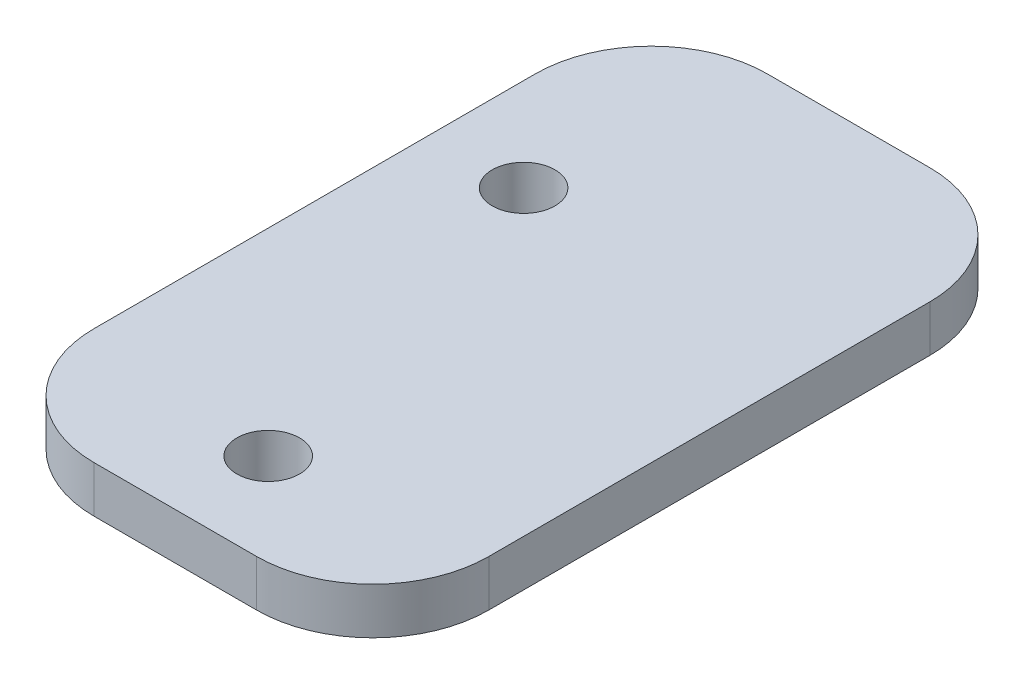
ISO-10303-21;
HEADER;
FILE_DESCRIPTION(('STEP AP214'),'2;1');
FILE_NAME('part.step','',(''),(''),'','','');
FILE_SCHEMA(('AUTOMOTIVE_DESIGN { 1 0 10303 214 1 1 1 1 }'));
ENDSEC;
DATA;
#1=APPLICATION_CONTEXT('core data for automotive mechanical design processes');
#2=APPLICATION_PROTOCOL_DEFINITION('international standard','automotive_design',2000,#1);
#3=PRODUCT_CONTEXT('',#1,'mechanical');
#4=PRODUCT('Part','Part','',(#3));
#5=PRODUCT_RELATED_PRODUCT_CATEGORY('part','',(#4));
#6=PRODUCT_DEFINITION_FORMATION('','',#4);
#7=PRODUCT_DEFINITION_CONTEXT('part definition',#1,'design');
#8=PRODUCT_DEFINITION('design','',#6,#7);
#9=PRODUCT_DEFINITION_SHAPE('','',#8);
#10=(LENGTH_UNIT() NAMED_UNIT(*) SI_UNIT(.MILLI.,.METRE.));
#11=(NAMED_UNIT(*) PLANE_ANGLE_UNIT() SI_UNIT($,.RADIAN.));
#12=(NAMED_UNIT(*) SI_UNIT($,.STERADIAN.) SOLID_ANGLE_UNIT());
#13=UNCERTAINTY_MEASURE_WITH_UNIT(LENGTH_MEASURE(1.E-05),#10,'distance_accuracy_value','');
#14=(GEOMETRIC_REPRESENTATION_CONTEXT(3) GLOBAL_UNCERTAINTY_ASSIGNED_CONTEXT((#13)) GLOBAL_UNIT_ASSIGNED_CONTEXT((#10,
#11,#12)) REPRESENTATION_CONTEXT('',''));
#15=CARTESIAN_POINT('',(0.,0.,0.));
#16=DIRECTION('',(0.,0.,1.));
#17=DIRECTION('',(1.,0.,0.));
#18=AXIS2_PLACEMENT_3D('',#15,#16,#17);
#19=CARTESIAN_POINT('',(0.,2.,0.));
#20=DIRECTION('',(0.,-1.,0.));
#21=DIRECTION('',(0.,0.,-1.));
#22=AXIS2_PLACEMENT_3D('',#19,#20,#21);
#23=PLANE('',#22);
#24=DIRECTION('',(1.,0.,0.));
#25=VECTOR('',#24,1.);
#26=CARTESIAN_POINT('',(-8.5,2.,14.5));
#27=LINE('',#26,#25);
#28=CARTESIAN_POINT('',(-3.5,2.,14.5));
#29=VERTEX_POINT('',#28);
#30=CARTESIAN_POINT('',(3.5,2.,14.5));
#31=VERTEX_POINT('',#30);
#32=EDGE_CURVE('E138',#29,#31,#27,.T.);
#33=ORIENTED_EDGE('',*,*,#32,.T.);
#34=CARTESIAN_POINT('',(3.5,2.,9.5));
#35=DIRECTION('',(0.,-1.,0.));
#36=DIRECTION('',(0.,0.,-1.));
#37=AXIS2_PLACEMENT_3D('',#34,#35,#36);
#38=CIRCLE('',#37,5.);
#39=CARTESIAN_POINT('',(8.5,2.,9.5));
#40=VERTEX_POINT('',#39);
#41=EDGE_CURVE('E156',#31,#40,#38,.F.);
#42=ORIENTED_EDGE('',*,*,#41,.T.);
#43=DIRECTION('',(0.,0.,-1.));
#44=VECTOR('',#43,1.);
#45=CARTESIAN_POINT('',(8.5,2.,14.5));
#46=LINE('',#45,#44);
#47=CARTESIAN_POINT('',(8.5,2.,-9.49999999999999));
#48=VERTEX_POINT('',#47);
#49=EDGE_CURVE('E120',#40,#48,#46,.T.);
#50=ORIENTED_EDGE('',*,*,#49,.T.);
#51=CARTESIAN_POINT('',(3.5,2.,-9.5));
#52=DIRECTION('',(0.,-1.,0.));
#53=DIRECTION('',(0.,0.,-1.));
#54=AXIS2_PLACEMENT_3D('',#51,#52,#53);
#55=CIRCLE('',#54,5.);
#56=CARTESIAN_POINT('',(3.5,2.,-14.5));
#57=VERTEX_POINT('',#56);
#58=EDGE_CURVE('E153',#48,#57,#55,.F.);
#59=ORIENTED_EDGE('',*,*,#58,.T.);
#60=DIRECTION('',(-1.,0.,0.));
#61=VECTOR('',#60,1.);
#62=CARTESIAN_POINT('',(-8.5,2.,-14.5));
#63=LINE('',#62,#61);
#64=CARTESIAN_POINT('',(-3.5,2.,-14.5));
#65=VERTEX_POINT('',#64);
#66=EDGE_CURVE('E167',#57,#65,#63,.T.);
#67=ORIENTED_EDGE('',*,*,#66,.T.);
#68=CARTESIAN_POINT('',(-3.5,2.,-9.5));
#69=DIRECTION('',(0.,-1.,0.));
#70=DIRECTION('',(0.,0.,-1.));
#71=AXIS2_PLACEMENT_3D('',#68,#69,#70);
#72=CIRCLE('',#71,5.);
#73=CARTESIAN_POINT('',(-8.5,2.,-9.49999999999999));
#74=VERTEX_POINT('',#73);
#75=EDGE_CURVE('E56',#65,#74,#72,.F.);
#76=ORIENTED_EDGE('',*,*,#75,.T.);
#77=DIRECTION('',(0.,0.,1.));
#78=VECTOR('',#77,1.);
#79=CARTESIAN_POINT('',(-8.5,2.,14.5));
#80=LINE('',#79,#78);
#81=CARTESIAN_POINT('',(-8.5,2.,9.5));
#82=VERTEX_POINT('',#81);
#83=EDGE_CURVE('E175',#74,#82,#80,.T.);
#84=ORIENTED_EDGE('',*,*,#83,.T.);
#85=CARTESIAN_POINT('',(-3.5,2.,9.5));
#86=DIRECTION('',(0.,-1.,0.));
#87=DIRECTION('',(0.,0.,-1.));
#88=AXIS2_PLACEMENT_3D('',#85,#86,#87);
#89=CIRCLE('',#88,5.);
#90=EDGE_CURVE('E151',#82,#29,#89,.F.);
#91=ORIENTED_EDGE('',*,*,#90,.T.);
#92=EDGE_LOOP('',(#33,#42,#50,#59,#67,#76,#84,#91));
#93=FACE_BOUND('',#92,.T.);
#94=CARTESIAN_POINT('',(0.,2.,10.5));
#95=DIRECTION('',(0.,1.,0.));
#96=DIRECTION('',(0.,0.,1.));
#97=AXIS2_PLACEMENT_3D('',#94,#95,#96);
#98=CIRCLE('',#97,1.35);
#99=CARTESIAN_POINT('',(0.,2.,11.85));
#100=VERTEX_POINT('',#99);
#101=EDGE_CURVE('E129',#100,#100,#98,.T.);
#102=ORIENTED_EDGE('',*,*,#101,.F.);
#103=EDGE_LOOP('',(#102));
#104=FACE_BOUND('',#103,.T.);
#105=CARTESIAN_POINT('',(-4.5,2.,-5.));
#106=DIRECTION('',(0.,1.,0.));
#107=DIRECTION('',(0.,0.,1.));
#108=AXIS2_PLACEMENT_3D('',#105,#106,#107);
#109=CIRCLE('',#108,1.35);
#110=CARTESIAN_POINT('',(-4.5,2.,-3.65));
#111=VERTEX_POINT('',#110);
#112=EDGE_CURVE('E182',#111,#111,#109,.T.);
#113=ORIENTED_EDGE('',*,*,#112,.F.);
#114=EDGE_LOOP('',(#113));
#115=FACE_BOUND('',#114,.T.);
#116=ADVANCED_FACE('F34',(#93,#104,#115),#23,.F.);
#117=CARTESIAN_POINT('',(0.,0.,0.));
#118=DIRECTION('',(0.,-1.,0.));
#119=DIRECTION('',(0.,0.,-1.));
#120=AXIS2_PLACEMENT_3D('',#117,#118,#119);
#121=PLANE('',#120);
#122=CARTESIAN_POINT('',(0.,0.,10.5));
#123=DIRECTION('',(0.,1.,0.));
#124=DIRECTION('',(0.,0.,1.));
#125=AXIS2_PLACEMENT_3D('',#122,#123,#124);
#126=CIRCLE('',#125,1.35);
#127=CARTESIAN_POINT('',(0.,0.,11.85));
#128=VERTEX_POINT('',#127);
#129=EDGE_CURVE('E135',#128,#128,#126,.T.);
#130=ORIENTED_EDGE('',*,*,#129,.T.);
#131=EDGE_LOOP('',(#130));
#132=FACE_BOUND('',#131,.T.);
#133=DIRECTION('',(0.,0.,-1.));
#134=VECTOR('',#133,1.);
#135=CARTESIAN_POINT('',(8.5,0.,14.5));
#136=LINE('',#135,#134);
#137=CARTESIAN_POINT('',(8.5,0.,9.5));
#138=VERTEX_POINT('',#137);
#139=CARTESIAN_POINT('',(8.5,0.,-9.49999999999999));
#140=VERTEX_POINT('',#139);
#141=EDGE_CURVE('E117',#138,#140,#136,.T.);
#142=ORIENTED_EDGE('',*,*,#141,.F.);
#143=CARTESIAN_POINT('',(3.5,0.,9.5));
#144=DIRECTION('',(0.,-1.,0.));
#145=DIRECTION('',(0.,0.,-1.));
#146=AXIS2_PLACEMENT_3D('',#143,#144,#145);
#147=CIRCLE('',#146,5.);
#148=CARTESIAN_POINT('',(3.5,0.,14.5));
#149=VERTEX_POINT('',#148);
#150=EDGE_CURVE('E100',#138,#149,#147,.T.);
#151=ORIENTED_EDGE('',*,*,#150,.T.);
#152=DIRECTION('',(1.,0.,0.));
#153=VECTOR('',#152,1.);
#154=CARTESIAN_POINT('',(-8.5,0.,14.5));
#155=LINE('',#154,#153);
#156=CARTESIAN_POINT('',(-3.5,0.,14.5));
#157=VERTEX_POINT('',#156);
#158=EDGE_CURVE('E142',#157,#149,#155,.T.);
#159=ORIENTED_EDGE('',*,*,#158,.F.);
#160=CARTESIAN_POINT('',(-3.5,0.,9.5));
#161=DIRECTION('',(0.,-1.,0.));
#162=DIRECTION('',(0.,0.,-1.));
#163=AXIS2_PLACEMENT_3D('',#160,#161,#162);
#164=CIRCLE('',#163,5.);
#165=CARTESIAN_POINT('',(-8.5,0.,9.5));
#166=VERTEX_POINT('',#165);
#167=EDGE_CURVE('E121',#157,#166,#164,.T.);
#168=ORIENTED_EDGE('',*,*,#167,.T.);
#169=DIRECTION('',(0.,0.,1.));
#170=VECTOR('',#169,1.);
#171=CARTESIAN_POINT('',(-8.5,0.,14.5));
#172=LINE('',#171,#170);
#173=CARTESIAN_POINT('',(-8.5,0.,-9.49999999999999));
#174=VERTEX_POINT('',#173);
#175=EDGE_CURVE('E132',#174,#166,#172,.T.);
#176=ORIENTED_EDGE('',*,*,#175,.F.);
#177=CARTESIAN_POINT('',(-3.5,0.,-9.5));
#178=DIRECTION('',(0.,-1.,0.));
#179=DIRECTION('',(0.,0.,-1.));
#180=AXIS2_PLACEMENT_3D('',#177,#178,#179);
#181=CIRCLE('',#180,5.);
#182=CARTESIAN_POINT('',(-3.5,0.,-14.5));
#183=VERTEX_POINT('',#182);
#184=EDGE_CURVE('E111',#174,#183,#181,.T.);
#185=ORIENTED_EDGE('',*,*,#184,.T.);
#186=DIRECTION('',(-1.,0.,0.));
#187=VECTOR('',#186,1.);
#188=CARTESIAN_POINT('',(-8.5,0.,-14.5));
#189=LINE('',#188,#187);
#190=CARTESIAN_POINT('',(3.5,0.,-14.5));
#191=VERTEX_POINT('',#190);
#192=EDGE_CURVE('E128',#191,#183,#189,.T.);
#193=ORIENTED_EDGE('',*,*,#192,.F.);
#194=CARTESIAN_POINT('',(3.5,0.,-9.5));
#195=DIRECTION('',(0.,-1.,0.));
#196=DIRECTION('',(0.,0.,-1.));
#197=AXIS2_PLACEMENT_3D('',#194,#195,#196);
#198=CIRCLE('',#197,5.);
#199=EDGE_CURVE('E127',#191,#140,#198,.T.);
#200=ORIENTED_EDGE('',*,*,#199,.T.);
#201=EDGE_LOOP('',(#142,#151,#159,#168,#176,#185,#193,#200));
#202=FACE_BOUND('',#201,.T.);
#203=CARTESIAN_POINT('',(-4.5,0.,-5.));
#204=DIRECTION('',(0.,1.,0.));
#205=DIRECTION('',(0.,0.,1.));
#206=AXIS2_PLACEMENT_3D('',#203,#204,#205);
#207=CIRCLE('',#206,1.35);
#208=CARTESIAN_POINT('',(-4.5,0.,-3.65));
#209=VERTEX_POINT('',#208);
#210=EDGE_CURVE('E184',#209,#209,#207,.T.);
#211=ORIENTED_EDGE('',*,*,#210,.T.);
#212=EDGE_LOOP('',(#211));
#213=FACE_BOUND('',#212,.T.);
#214=ADVANCED_FACE('F124',(#132,#202,#213),#121,.T.);
#215=CARTESIAN_POINT('',(8.5,2.,14.5));
#216=DIRECTION('',(-1.,0.,0.));
#217=DIRECTION('',(0.,0.,1.));
#218=AXIS2_PLACEMENT_3D('',#215,#216,#217);
#219=PLANE('',#218);
#220=ORIENTED_EDGE('',*,*,#49,.F.);
#221=DIRECTION('',(0.,-1.,0.));
#222=VECTOR('',#221,1.);
#223=CARTESIAN_POINT('',(8.5,2.,9.5));
#224=LINE('',#223,#222);
#225=EDGE_CURVE('E104',#40,#138,#224,.T.);
#226=ORIENTED_EDGE('',*,*,#225,.T.);
#227=ORIENTED_EDGE('',*,*,#141,.T.);
#228=DIRECTION('',(0.,-1.,0.));
#229=VECTOR('',#228,1.);
#230=CARTESIAN_POINT('',(8.5,2.,-9.5));
#231=LINE('',#230,#229);
#232=EDGE_CURVE('E122',#140,#48,#231,.F.);
#233=ORIENTED_EDGE('',*,*,#232,.T.);
#234=EDGE_LOOP('',(#220,#226,#227,#233));
#235=FACE_BOUND('',#234,.T.);
#236=ADVANCED_FACE('F116',(#235),#219,.F.);
#237=CARTESIAN_POINT('',(-8.5,2.,-14.5));
#238=DIRECTION('',(0.,0.,1.));
#239=DIRECTION('',(1.,0.,0.));
#240=AXIS2_PLACEMENT_3D('',#237,#238,#239);
#241=PLANE('',#240);
#242=ORIENTED_EDGE('',*,*,#192,.T.);
#243=DIRECTION('',(0.,-1.,0.));
#244=VECTOR('',#243,1.);
#245=CARTESIAN_POINT('',(-3.5,2.,-14.5));
#246=LINE('',#245,#244);
#247=EDGE_CURVE('E11',#183,#65,#246,.F.);
#248=ORIENTED_EDGE('',*,*,#247,.T.);
#249=ORIENTED_EDGE('',*,*,#66,.F.);
#250=DIRECTION('',(0.,-1.,0.));
#251=VECTOR('',#250,1.);
#252=CARTESIAN_POINT('',(3.5,2.,-14.5));
#253=LINE('',#252,#251);
#254=EDGE_CURVE('E42',#57,#191,#253,.T.);
#255=ORIENTED_EDGE('',*,*,#254,.T.);
#256=EDGE_LOOP('',(#242,#248,#249,#255));
#257=FACE_BOUND('',#256,.T.);
#258=ADVANCED_FACE('F165',(#257),#241,.F.);
#259=CARTESIAN_POINT('',(-8.5,2.,14.5));
#260=DIRECTION('',(1.,0.,0.));
#261=DIRECTION('',(0.,0.,-1.));
#262=AXIS2_PLACEMENT_3D('',#259,#260,#261);
#263=PLANE('',#262);
#264=ORIENTED_EDGE('',*,*,#83,.F.);
#265=DIRECTION('',(0.,-1.,0.));
#266=VECTOR('',#265,1.);
#267=CARTESIAN_POINT('',(-8.5,2.,-9.5));
#268=LINE('',#267,#266);
#269=EDGE_CURVE('E159',#74,#174,#268,.T.);
#270=ORIENTED_EDGE('',*,*,#269,.T.);
#271=ORIENTED_EDGE('',*,*,#175,.T.);
#272=DIRECTION('',(0.,-1.,0.));
#273=VECTOR('',#272,1.);
#274=CARTESIAN_POINT('',(-8.5,2.,9.5));
#275=LINE('',#274,#273);
#276=EDGE_CURVE('E49',#166,#82,#275,.F.);
#277=ORIENTED_EDGE('',*,*,#276,.T.);
#278=EDGE_LOOP('',(#264,#270,#271,#277));
#279=FACE_BOUND('',#278,.T.);
#280=ADVANCED_FACE('F174',(#279),#263,.F.);
#281=CARTESIAN_POINT('',(-8.5,2.,14.5));
#282=DIRECTION('',(0.,0.,-1.));
#283=DIRECTION('',(-1.,0.,0.));
#284=AXIS2_PLACEMENT_3D('',#281,#282,#283);
#285=PLANE('',#284);
#286=ORIENTED_EDGE('',*,*,#158,.T.);
#287=DIRECTION('',(0.,-1.,0.));
#288=VECTOR('',#287,1.);
#289=CARTESIAN_POINT('',(3.5,2.,14.5));
#290=LINE('',#289,#288);
#291=EDGE_CURVE('E105',#149,#31,#290,.F.);
#292=ORIENTED_EDGE('',*,*,#291,.T.);
#293=ORIENTED_EDGE('',*,*,#32,.F.);
#294=DIRECTION('',(0.,-1.,0.));
#295=VECTOR('',#294,1.);
#296=CARTESIAN_POINT('',(-3.5,2.,14.5));
#297=LINE('',#296,#295);
#298=EDGE_CURVE('E110',#29,#157,#297,.T.);
#299=ORIENTED_EDGE('',*,*,#298,.T.);
#300=EDGE_LOOP('',(#286,#292,#293,#299));
#301=FACE_BOUND('',#300,.T.);
#302=ADVANCED_FACE('F205',(#301),#285,.F.);
#303=CARTESIAN_POINT('',(0.,2.,10.5));
#304=DIRECTION('',(0.,-1.,0.));
#305=DIRECTION('',(0.,0.,-1.));
#306=AXIS2_PLACEMENT_3D('',#303,#304,#305);
#307=CYLINDRICAL_SURFACE('',#306,1.35);
#308=ORIENTED_EDGE('',*,*,#101,.T.);
#309=EDGE_LOOP('',(#308));
#310=FACE_BOUND('',#309,.T.);
#311=ORIENTED_EDGE('',*,*,#129,.F.);
#312=EDGE_LOOP('',(#311));
#313=FACE_BOUND('',#312,.T.);
#314=ADVANCED_FACE('F202',(#310,#313),#307,.F.);
#315=CARTESIAN_POINT('',(-4.5,2.,-5.));
#316=DIRECTION('',(0.,-1.,0.));
#317=DIRECTION('',(0.,0.,-1.));
#318=AXIS2_PLACEMENT_3D('',#315,#316,#317);
#319=CYLINDRICAL_SURFACE('',#318,1.35);
#320=ORIENTED_EDGE('',*,*,#112,.T.);
#321=EDGE_LOOP('',(#320));
#322=FACE_BOUND('',#321,.T.);
#323=ORIENTED_EDGE('',*,*,#210,.F.);
#324=EDGE_LOOP('',(#323));
#325=FACE_BOUND('',#324,.T.);
#326=ADVANCED_FACE('F190',(#322,#325),#319,.F.);
#327=CARTESIAN_POINT('',(3.5,2.,9.5));
#328=DIRECTION('',(0.,-1.,0.));
#329=DIRECTION('',(0.,0.,-1.));
#330=AXIS2_PLACEMENT_3D('',#327,#328,#329);
#331=CYLINDRICAL_SURFACE('',#330,5.);
#332=ORIENTED_EDGE('',*,*,#41,.F.);
#333=ORIENTED_EDGE('',*,*,#291,.F.);
#334=ORIENTED_EDGE('',*,*,#150,.F.);
#335=ORIENTED_EDGE('',*,*,#225,.F.);
#336=EDGE_LOOP('',(#332,#333,#334,#335));
#337=FACE_BOUND('',#336,.T.);
#338=ADVANCED_FACE('F103',(#337),#331,.T.);
#339=CARTESIAN_POINT('',(-3.5,2.,-9.5));
#340=DIRECTION('',(0.,-1.,0.));
#341=DIRECTION('',(0.,0.,-1.));
#342=AXIS2_PLACEMENT_3D('',#339,#340,#341);
#343=CYLINDRICAL_SURFACE('',#342,5.);
#344=ORIENTED_EDGE('',*,*,#75,.F.);
#345=ORIENTED_EDGE('',*,*,#247,.F.);
#346=ORIENTED_EDGE('',*,*,#184,.F.);
#347=ORIENTED_EDGE('',*,*,#269,.F.);
#348=EDGE_LOOP('',(#344,#345,#346,#347));
#349=FACE_BOUND('',#348,.T.);
#350=ADVANCED_FACE('F173',(#349),#343,.T.);
#351=CARTESIAN_POINT('',(3.5,2.,-9.5));
#352=DIRECTION('',(0.,-1.,0.));
#353=DIRECTION('',(0.,0.,-1.));
#354=AXIS2_PLACEMENT_3D('',#351,#352,#353);
#355=CYLINDRICAL_SURFACE('',#354,5.);
#356=ORIENTED_EDGE('',*,*,#58,.F.);
#357=ORIENTED_EDGE('',*,*,#232,.F.);
#358=ORIENTED_EDGE('',*,*,#199,.F.);
#359=ORIENTED_EDGE('',*,*,#254,.F.);
#360=EDGE_LOOP('',(#356,#357,#358,#359));
#361=FACE_BOUND('',#360,.T.);
#362=ADVANCED_FACE('F218',(#361),#355,.T.);
#363=CARTESIAN_POINT('',(-3.5,2.,9.5));
#364=DIRECTION('',(0.,-1.,0.));
#365=DIRECTION('',(0.,0.,-1.));
#366=AXIS2_PLACEMENT_3D('',#363,#364,#365);
#367=CYLINDRICAL_SURFACE('',#366,5.);
#368=ORIENTED_EDGE('',*,*,#90,.F.);
#369=ORIENTED_EDGE('',*,*,#276,.F.);
#370=ORIENTED_EDGE('',*,*,#167,.F.);
#371=ORIENTED_EDGE('',*,*,#298,.F.);
#372=EDGE_LOOP('',(#368,#369,#370,#371));
#373=FACE_BOUND('',#372,.T.);
#374=ADVANCED_FACE('F36',(#373),#367,.T.);
#375=CLOSED_SHELL('',(#116,#214,#236,#258,#280,#302,#314,#326,#338,#350,#362,#374));
#376=MANIFOLD_SOLID_BREP('B2',#375);
#377=ADVANCED_BREP_SHAPE_REPRESENTATION('',(#18,#376),#14);
#378=SHAPE_DEFINITION_REPRESENTATION(#9,#377);
ENDSEC;
END-ISO-10303-21;
